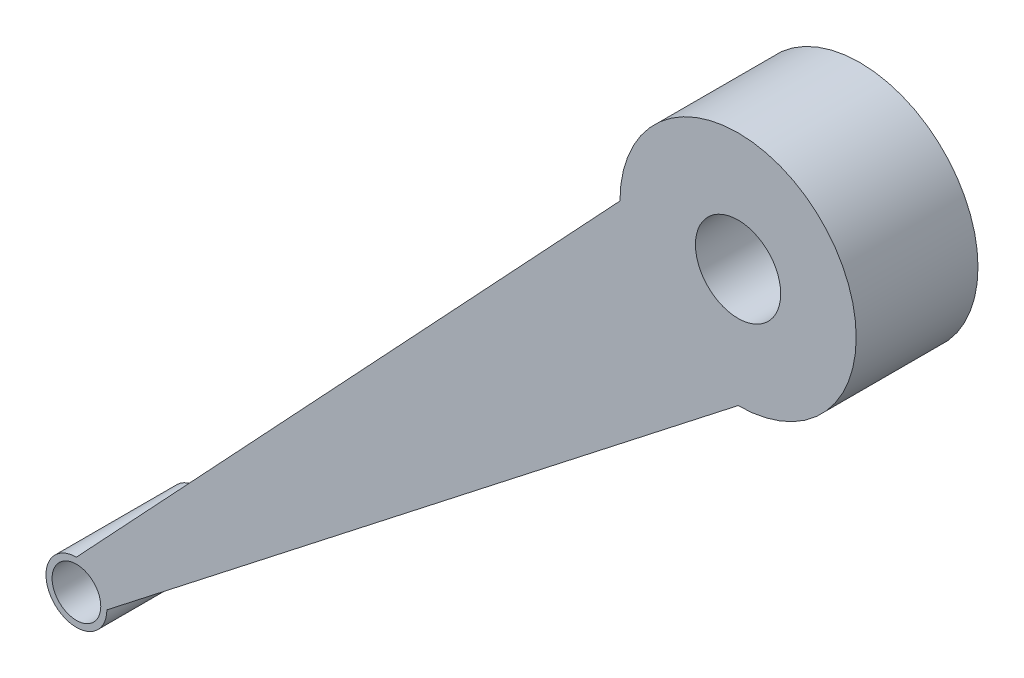
ISO-10303-21;
HEADER;
FILE_DESCRIPTION(('STEP AP214'),'2;1');
FILE_NAME('part.step','',(''),(''),'','','');
FILE_SCHEMA(('AUTOMOTIVE_DESIGN { 1 0 10303 214 1 1 1 1 }'));
ENDSEC;
DATA;
#1=APPLICATION_CONTEXT('core data for automotive mechanical design processes');
#2=APPLICATION_PROTOCOL_DEFINITION('international standard','automotive_design',2000,#1);
#3=PRODUCT_CONTEXT('',#1,'mechanical');
#4=PRODUCT('Part','Part','',(#3));
#5=PRODUCT_RELATED_PRODUCT_CATEGORY('part','',(#4));
#6=PRODUCT_DEFINITION_FORMATION('','',#4);
#7=PRODUCT_DEFINITION_CONTEXT('part definition',#1,'design');
#8=PRODUCT_DEFINITION('design','',#6,#7);
#9=PRODUCT_DEFINITION_SHAPE('','',#8);
#10=(LENGTH_UNIT() NAMED_UNIT(*) SI_UNIT(.MILLI.,.METRE.));
#11=(NAMED_UNIT(*) PLANE_ANGLE_UNIT() SI_UNIT($,.RADIAN.));
#12=(NAMED_UNIT(*) SI_UNIT($,.STERADIAN.) SOLID_ANGLE_UNIT());
#13=UNCERTAINTY_MEASURE_WITH_UNIT(LENGTH_MEASURE(1.E-05),#10,'distance_accuracy_value','');
#14=(GEOMETRIC_REPRESENTATION_CONTEXT(3) GLOBAL_UNCERTAINTY_ASSIGNED_CONTEXT((#13)) GLOBAL_UNIT_ASSIGNED_CONTEXT((#10,
#11,#12)) REPRESENTATION_CONTEXT('',''));
#15=CARTESIAN_POINT('',(0.,0.,0.));
#16=DIRECTION('',(0.,0.,1.));
#17=DIRECTION('',(1.,0.,0.));
#18=AXIS2_PLACEMENT_3D('',#15,#16,#17);
#19=CARTESIAN_POINT('',(0.,1.99999999999999,10.));
#20=DIRECTION('',(0.,0.,-1.));
#21=DIRECTION('',(-1.,0.,0.));
#22=AXIS2_PLACEMENT_3D('',#19,#20,#21);
#23=CYLINDRICAL_SURFACE('',#22,2.5);
#24=CARTESIAN_POINT('',(0.,1.99999999999999,5.));
#25=DIRECTION('',(0.,0.,1.));
#26=DIRECTION('',(1.,0.,0.));
#27=AXIS2_PLACEMENT_3D('',#24,#25,#26);
#28=CIRCLE('',#27,2.5);
#29=CARTESIAN_POINT('',(2.25573789684042,3.07779707772748,5.));
#30=VERTEX_POINT('',#29);
#31=CARTESIAN_POINT('',(1.12141430777746,4.2343746217481,5.));
#32=VERTEX_POINT('',#31);
#33=EDGE_CURVE('E137',#30,#32,#28,.T.);
#34=ORIENTED_EDGE('',*,*,#33,.F.);
#35=DIRECTION('',(0.,0.,-1.));
#36=VECTOR('',#35,1.);
#37=CARTESIAN_POINT('',(2.25573789684042,3.07779707772748,10.));
#38=LINE('',#37,#36);
#39=CARTESIAN_POINT('',(2.25573789684042,3.07779707772748,0.));
#40=VERTEX_POINT('',#39);
#41=EDGE_CURVE('E68',#30,#40,#38,.T.);
#42=ORIENTED_EDGE('',*,*,#41,.T.);
#43=CARTESIAN_POINT('',(0.,1.99999999999999,0.));
#44=DIRECTION('',(0.,0.,1.));
#45=DIRECTION('',(1.,0.,0.));
#46=AXIS2_PLACEMENT_3D('',#43,#44,#45);
#47=CIRCLE('',#46,2.5);
#48=CARTESIAN_POINT('',(1.12141430777746,4.23437462174809,0.));
#49=VERTEX_POINT('',#48);
#50=EDGE_CURVE('E191',#40,#49,#47,.T.);
#51=ORIENTED_EDGE('',*,*,#50,.T.);
#52=DIRECTION('',(0.,0.,-1.));
#53=VECTOR('',#52,1.);
#54=CARTESIAN_POINT('',(1.12141430777746,4.23437462174809,10.));
#55=LINE('',#54,#53);
#56=EDGE_CURVE('E158',#32,#49,#55,.T.);
#57=ORIENTED_EDGE('',*,*,#56,.F.);
#58=EDGE_LOOP('',(#34,#42,#51,#57));
#59=FACE_BOUND('',#58,.T.);
#60=ADVANCED_FACE('F64',(#59),#23,.T.);
#61=CARTESIAN_POINT('',(-1.51542000767577,1.41964116131676,10.));
#62=DIRECTION('',(-0.729793083298628,0.683668088745907,0.));
#63=DIRECTION('',(-0.683668088745907,-0.729793083298628,0.));
#64=AXIS2_PLACEMENT_3D('',#61,#62,#63);
#65=PLANE('',#64);
#66=DIRECTION('',(0.683668088745907,0.729793083298628,0.));
#67=VECTOR('',#66,1.);
#68=CARTESIAN_POINT('',(-1.51542000767577,1.41964116131676,5.));
#69=LINE('',#68,#67);
#70=CARTESIAN_POINT('',(45.6369890721945,51.7532790388426,5.));
#71=VERTEX_POINT('',#70);
#72=EDGE_CURVE('E134',#32,#71,#69,.T.);
#73=ORIENTED_EDGE('',*,*,#72,.F.);
#74=ORIENTED_EDGE('',*,*,#56,.T.);
#75=DIRECTION('',(0.683668088745907,0.729793083298628,0.));
#76=VECTOR('',#75,1.);
#77=CARTESIAN_POINT('',(-1.51542000767577,1.41964116131676,0.));
#78=LINE('',#77,#76);
#79=CARTESIAN_POINT('',(45.6369890721945,51.7532790388426,0.));
#80=VERTEX_POINT('',#79);
#81=EDGE_CURVE('E155',#49,#80,#78,.T.);
#82=ORIENTED_EDGE('',*,*,#81,.T.);
#83=DIRECTION('',(0.,0.,-1.));
#84=VECTOR('',#83,1.);
#85=CARTESIAN_POINT('',(45.6369890721945,51.7532790388426,10.));
#86=LINE('',#85,#84);
#87=EDGE_CURVE('E147',#71,#80,#86,.T.);
#88=ORIENTED_EDGE('',*,*,#87,.F.);
#89=EDGE_LOOP('',(#73,#74,#82,#88));
#90=FACE_BOUND('',#89,.T.);
#91=ADVANCED_FACE('F153',(#90),#65,.F.);
#92=CARTESIAN_POINT('',(54.3284182216313,52.13936107717,10.));
#93=DIRECTION('',(0.,0.,-1.));
#94=DIRECTION('',(-1.,0.,0.));
#95=AXIS2_PLACEMENT_3D('',#92,#93,#94);
#96=CYLINDRICAL_SURFACE('',#95,8.69999999999999);
#97=DIRECTION('',(0.,0.,-1.));
#98=VECTOR('',#97,1.);
#99=CARTESIAN_POINT('',(53.9927510329799,43.4458389176272,10.));
#100=LINE('',#99,#98);
#101=CARTESIAN_POINT('',(53.9927510329799,43.4458389176272,5.));
#102=VERTEX_POINT('',#101);
#103=CARTESIAN_POINT('',(53.9927510329799,43.4458389176272,0.));
#104=VERTEX_POINT('',#103);
#105=EDGE_CURVE('E149',#102,#104,#100,.T.);
#106=ORIENTED_EDGE('',*,*,#105,.F.);
#107=CARTESIAN_POINT('',(54.3284182216313,52.13936107717,5.));
#108=DIRECTION('',(0.,0.,1.));
#109=DIRECTION('',(1.,0.,0.));
#110=AXIS2_PLACEMENT_3D('',#107,#108,#109);
#111=CIRCLE('',#110,8.69999999999999);
#112=EDGE_CURVE('E82',#71,#102,#111,.F.);
#113=ORIENTED_EDGE('',*,*,#112,.F.);
#114=ORIENTED_EDGE('',*,*,#87,.T.);
#115=CARTESIAN_POINT('',(54.3284182216313,52.13936107717,0.));
#116=DIRECTION('',(0.,0.,1.));
#117=DIRECTION('',(1.,0.,0.));
#118=AXIS2_PLACEMENT_3D('',#115,#116,#117);
#119=CIRCLE('',#118,8.69999999999999);
#120=EDGE_CURVE('E186',#104,#80,#119,.T.);
#121=ORIENTED_EDGE('',*,*,#120,.F.);
#122=EDGE_LOOP('',(#106,#113,#114,#121));
#123=FACE_BOUND('',#122,.T.);
#124=ADVANCED_FACE('F145',(#123),#96,.F.);
#125=CARTESIAN_POINT('',(-0.639097527111956,0.819088458305751,10.));
#126=DIRECTION('',(-0.615156584574477,0.788404957147445,0.));
#127=DIRECTION('',(-0.788404957147445,-0.615156584574477,0.));
#128=AXIS2_PLACEMENT_3D('',#125,#126,#127);
#129=PLANE('',#128);
#130=ORIENTED_EDGE('',*,*,#41,.F.);
#131=DIRECTION('',(-0.788404957147445,-0.615156584574477,0.));
#132=VECTOR('',#131,1.);
#133=CARTESIAN_POINT('',(-0.639097527111956,0.819088458305751,5.));
#134=LINE('',#133,#132);
#135=EDGE_CURVE('E151',#102,#30,#134,.T.);
#136=ORIENTED_EDGE('',*,*,#135,.F.);
#137=ORIENTED_EDGE('',*,*,#105,.T.);
#138=DIRECTION('',(0.788404957147445,0.615156584574477,0.));
#139=VECTOR('',#138,1.);
#140=CARTESIAN_POINT('',(-0.639097527111956,0.819088458305751,0.));
#141=LINE('',#140,#139);
#142=EDGE_CURVE('E195',#40,#104,#141,.T.);
#143=ORIENTED_EDGE('',*,*,#142,.F.);
#144=EDGE_LOOP('',(#130,#136,#137,#143));
#145=FACE_BOUND('',#144,.T.);
#146=ADVANCED_FACE('F66',(#145),#129,.T.);
#147=CARTESIAN_POINT('',(0.,4.49999999999999,0.));
#148=VERTEX_POINT('',#147);
#149=CARTESIAN_POINT('',(2.49999999999999,1.99999999999999,0.));
#150=VERTEX_POINT('',#149);
#151=EDGE_CURVE('E185',#148,#150,#47,.T.);
#152=ORIENTED_EDGE('',*,*,#151,.T.);
#153=DIRECTION('',(0.,0.,-1.));
#154=VECTOR('',#153,1.);
#155=CARTESIAN_POINT('',(2.49999999999999,1.99999999999999,10.));
#156=LINE('',#155,#154);
#157=CARTESIAN_POINT('',(2.49999999999999,1.99999999999999,10.));
#158=VERTEX_POINT('',#157);
#159=EDGE_CURVE('E12',#158,#150,#156,.T.);
#160=ORIENTED_EDGE('',*,*,#159,.F.);
#161=CARTESIAN_POINT('',(0.,1.99999999999999,10.));
#162=DIRECTION('',(0.,0.,1.));
#163=DIRECTION('',(1.,0.,0.));
#164=AXIS2_PLACEMENT_3D('',#161,#162,#163);
#165=CIRCLE('',#164,2.5);
#166=CARTESIAN_POINT('',(0.,4.49999999999999,10.));
#167=VERTEX_POINT('',#166);
#168=EDGE_CURVE('E177',#167,#158,#165,.T.);
#169=ORIENTED_EDGE('',*,*,#168,.F.);
#170=DIRECTION('',(0.,0.,-1.));
#171=VECTOR('',#170,1.);
#172=CARTESIAN_POINT('',(0.,4.49999999999999,10.));
#173=LINE('',#172,#171);
#174=EDGE_CURVE('E91',#167,#148,#173,.T.);
#175=ORIENTED_EDGE('',*,*,#174,.T.);
#176=EDGE_LOOP('',(#152,#160,#169,#175));
#177=FACE_BOUND('',#176,.T.);
#178=ADVANCED_FACE('F246',(#177),#23,.T.);
#179=CARTESIAN_POINT('',(-0.0239409425374789,0.030683501158306,10.));
#180=DIRECTION('',(-0.615156584574477,0.788404957147445,0.));
#181=DIRECTION('',(-0.788404957147445,-0.615156584574477,0.));
#182=AXIS2_PLACEMENT_3D('',#179,#180,#181);
#183=PLANE('',#182);
#184=DIRECTION('',(0.788404957147445,0.615156584574477,0.));
#185=VECTOR('',#184,1.);
#186=CARTESIAN_POINT('',(-0.0239409425374789,0.030683501158306,0.));
#187=LINE('',#186,#185);
#188=CARTESIAN_POINT('',(54.3284182216313,42.43936107717,0.));
#189=VERTEX_POINT('',#188);
#190=EDGE_CURVE('E182',#150,#189,#187,.T.);
#191=ORIENTED_EDGE('',*,*,#190,.T.);
#192=DIRECTION('',(0.,0.,-1.));
#193=VECTOR('',#192,1.);
#194=CARTESIAN_POINT('',(54.3284182216313,42.43936107717,10.));
#195=LINE('',#194,#193);
#196=CARTESIAN_POINT('',(54.3284182216313,42.43936107717,10.));
#197=VERTEX_POINT('',#196);
#198=EDGE_CURVE('E74',#197,#189,#195,.T.);
#199=ORIENTED_EDGE('',*,*,#198,.F.);
#200=DIRECTION('',(0.788404957147445,0.615156584574477,0.));
#201=VECTOR('',#200,1.);
#202=CARTESIAN_POINT('',(-0.0239409425374789,0.030683501158306,10.));
#203=LINE('',#202,#201);
#204=EDGE_CURVE('E205',#158,#197,#203,.T.);
#205=ORIENTED_EDGE('',*,*,#204,.F.);
#206=ORIENTED_EDGE('',*,*,#159,.T.);
#207=EDGE_LOOP('',(#191,#199,#205,#206));
#208=FACE_BOUND('',#207,.T.);
#209=ADVANCED_FACE('F256',(#208),#183,.F.);
#210=CARTESIAN_POINT('',(54.3284182216313,52.13936107717,10.));
#211=DIRECTION('',(0.,0.,-1.));
#212=DIRECTION('',(-1.,0.,0.));
#213=AXIS2_PLACEMENT_3D('',#210,#211,#212);
#214=CYLINDRICAL_SURFACE('',#213,9.69999999999999);
#215=CARTESIAN_POINT('',(54.3284182216313,52.13936107717,0.));
#216=DIRECTION('',(0.,0.,1.));
#217=DIRECTION('',(1.,0.,0.));
#218=AXIS2_PLACEMENT_3D('',#215,#216,#217);
#219=CIRCLE('',#218,9.69999999999999);
#220=CARTESIAN_POINT('',(44.6284182216313,52.13936107717,0.));
#221=VERTEX_POINT('',#220);
#222=EDGE_CURVE('E178',#189,#221,#219,.T.);
#223=ORIENTED_EDGE('',*,*,#222,.T.);
#224=DIRECTION('',(0.,0.,-1.));
#225=VECTOR('',#224,1.);
#226=CARTESIAN_POINT('',(44.6284182216313,52.13936107717,10.));
#227=LINE('',#226,#225);
#228=CARTESIAN_POINT('',(44.6284182216313,52.13936107717,10.));
#229=VERTEX_POINT('',#228);
#230=EDGE_CURVE('E168',#229,#221,#227,.T.);
#231=ORIENTED_EDGE('',*,*,#230,.F.);
#232=CARTESIAN_POINT('',(54.3284182216313,52.13936107717,10.));
#233=DIRECTION('',(0.,0.,1.));
#234=DIRECTION('',(1.,0.,0.));
#235=AXIS2_PLACEMENT_3D('',#232,#233,#234);
#236=CIRCLE('',#235,9.69999999999999);
#237=EDGE_CURVE('E202',#197,#229,#236,.T.);
#238=ORIENTED_EDGE('',*,*,#237,.F.);
#239=ORIENTED_EDGE('',*,*,#198,.T.);
#240=EDGE_LOOP('',(#223,#231,#238,#239));
#241=FACE_BOUND('',#240,.T.);
#242=ADVANCED_FACE('F260',(#241),#214,.T.);
#243=CARTESIAN_POINT('',(-2.2452130909744,2.10330925006267,10.));
#244=DIRECTION('',(-0.729793083298628,0.683668088745907,0.));
#245=DIRECTION('',(-0.683668088745907,-0.729793083298628,0.));
#246=AXIS2_PLACEMENT_3D('',#243,#244,#245);
#247=PLANE('',#246);
#248=DIRECTION('',(0.683668088745907,0.729793083298628,0.));
#249=VECTOR('',#248,1.);
#250=CARTESIAN_POINT('',(-2.2452130909744,2.10330925006267,0.));
#251=LINE('',#250,#249);
#252=EDGE_CURVE('E173',#148,#221,#251,.T.);
#253=ORIENTED_EDGE('',*,*,#252,.F.);
#254=ORIENTED_EDGE('',*,*,#174,.F.);
#255=DIRECTION('',(0.683668088745907,0.729793083298628,0.));
#256=VECTOR('',#255,1.);
#257=CARTESIAN_POINT('',(-2.2452130909744,2.10330925006267,10.));
#258=LINE('',#257,#256);
#259=EDGE_CURVE('E162',#167,#229,#258,.T.);
#260=ORIENTED_EDGE('',*,*,#259,.T.);
#261=ORIENTED_EDGE('',*,*,#230,.T.);
#262=EDGE_LOOP('',(#253,#254,#260,#261));
#263=FACE_BOUND('',#262,.T.);
#264=ADVANCED_FACE('F270',(#263),#247,.T.);
#265=CARTESIAN_POINT('',(0.,0.,0.));
#266=DIRECTION('',(0.,0.,1.));
#267=DIRECTION('',(1.,0.,0.));
#268=AXIS2_PLACEMENT_3D('',#265,#266,#267);
#269=PLANE('',#268);
#270=CARTESIAN_POINT('',(0.,1.99999999999999,0.));
#271=DIRECTION('',(0.,0.,1.));
#272=DIRECTION('',(1.,0.,0.));
#273=AXIS2_PLACEMENT_3D('',#270,#271,#272);
#274=CIRCLE('',#273,2.);
#275=CARTESIAN_POINT('',(1.99999999999999,1.99999999999999,0.));
#276=VERTEX_POINT('',#275);
#277=EDGE_CURVE('E199',#276,#276,#274,.T.);
#278=ORIENTED_EDGE('',*,*,#277,.T.);
#279=EDGE_LOOP('',(#278));
#280=FACE_BOUND('',#279,.T.);
#281=ORIENTED_EDGE('',*,*,#190,.F.);
#282=ORIENTED_EDGE('',*,*,#151,.F.);
#283=ORIENTED_EDGE('',*,*,#252,.T.);
#284=ORIENTED_EDGE('',*,*,#222,.F.);
#285=EDGE_LOOP('',(#281,#282,#283,#284));
#286=FACE_BOUND('',#285,.T.);
#287=ORIENTED_EDGE('',*,*,#81,.F.);
#288=ORIENTED_EDGE('',*,*,#50,.F.);
#289=ORIENTED_EDGE('',*,*,#142,.T.);
#290=ORIENTED_EDGE('',*,*,#120,.T.);
#291=EDGE_LOOP('',(#287,#288,#289,#290));
#292=FACE_BOUND('',#291,.T.);
#293=ADVANCED_FACE('F264',(#280,#286,#292),#269,.F.);
#294=CARTESIAN_POINT('',(0.,0.,10.));
#295=DIRECTION('',(0.,0.,1.));
#296=DIRECTION('',(1.,0.,0.));
#297=AXIS2_PLACEMENT_3D('',#294,#295,#296);
#298=PLANE('',#297);
#299=CARTESIAN_POINT('',(54.3284182216313,52.13936107717,10.));
#300=DIRECTION('',(0.,0.,1.));
#301=DIRECTION('',(1.,0.,0.));
#302=AXIS2_PLACEMENT_3D('',#299,#300,#301);
#303=CIRCLE('',#302,3.5);
#304=CARTESIAN_POINT('',(57.8284182216314,52.13936107717,10.));
#305=VERTEX_POINT('',#304);
#306=EDGE_CURVE('E222',#305,#305,#303,.T.);
#307=ORIENTED_EDGE('',*,*,#306,.F.);
#308=EDGE_LOOP('',(#307));
#309=FACE_BOUND('',#308,.T.);
#310=CARTESIAN_POINT('',(0.,1.99999999999999,10.));
#311=DIRECTION('',(0.,0.,1.));
#312=DIRECTION('',(1.,0.,0.));
#313=AXIS2_PLACEMENT_3D('',#310,#311,#312);
#314=CIRCLE('',#313,2.);
#315=CARTESIAN_POINT('',(1.99999999999999,1.99999999999999,10.));
#316=VERTEX_POINT('',#315);
#317=EDGE_CURVE('E211',#316,#316,#314,.T.);
#318=ORIENTED_EDGE('',*,*,#317,.F.);
#319=EDGE_LOOP('',(#318));
#320=FACE_BOUND('',#319,.T.);
#321=ORIENTED_EDGE('',*,*,#168,.T.);
#322=ORIENTED_EDGE('',*,*,#204,.T.);
#323=ORIENTED_EDGE('',*,*,#237,.T.);
#324=ORIENTED_EDGE('',*,*,#259,.F.);
#325=EDGE_LOOP('',(#321,#322,#323,#324));
#326=FACE_BOUND('',#325,.T.);
#327=ADVANCED_FACE('F243',(#309,#320,#326),#298,.T.);
#328=CARTESIAN_POINT('',(0.,1.99999999999999,0.));
#329=DIRECTION('',(0.,0.,1.));
#330=DIRECTION('',(1.,0.,0.));
#331=AXIS2_PLACEMENT_3D('',#328,#329,#330);
#332=CYLINDRICAL_SURFACE('',#331,2.);
#333=ORIENTED_EDGE('',*,*,#277,.F.);
#334=EDGE_LOOP('',(#333));
#335=FACE_BOUND('',#334,.T.);
#336=ORIENTED_EDGE('',*,*,#317,.T.);
#337=EDGE_LOOP('',(#336));
#338=FACE_BOUND('',#337,.T.);
#339=ADVANCED_FACE('F234',(#335,#338),#332,.F.);
#340=CARTESIAN_POINT('',(0.,0.,5.));
#341=DIRECTION('',(0.,0.,1.));
#342=DIRECTION('',(1.,0.,0.));
#343=AXIS2_PLACEMENT_3D('',#340,#341,#342);
#344=PLANE('',#343);
#345=CARTESIAN_POINT('',(54.3284182216313,52.13936107717,5.));
#346=DIRECTION('',(0.,0.,-1.));
#347=DIRECTION('',(-1.,0.,0.));
#348=AXIS2_PLACEMENT_3D('',#345,#346,#347);
#349=CIRCLE('',#348,3.5);
#350=CARTESIAN_POINT('',(50.8284182216313,52.13936107717,5.));
#351=VERTEX_POINT('',#350);
#352=EDGE_CURVE('E226',#351,#351,#349,.T.);
#353=ORIENTED_EDGE('',*,*,#352,.F.);
#354=EDGE_LOOP('',(#353));
#355=FACE_BOUND('',#354,.T.);
#356=ORIENTED_EDGE('',*,*,#135,.T.);
#357=ORIENTED_EDGE('',*,*,#33,.T.);
#358=ORIENTED_EDGE('',*,*,#72,.T.);
#359=ORIENTED_EDGE('',*,*,#112,.T.);
#360=EDGE_LOOP('',(#356,#357,#358,#359));
#361=FACE_BOUND('',#360,.T.);
#362=ADVANCED_FACE('F135',(#355,#361),#344,.F.);
#363=CARTESIAN_POINT('',(54.3284182216313,52.13936107717,15.));
#364=DIRECTION('',(0.,0.,-1.));
#365=DIRECTION('',(-1.,0.,0.));
#366=AXIS2_PLACEMENT_3D('',#363,#364,#365);
#367=CYLINDRICAL_SURFACE('',#366,3.5);
#368=ORIENTED_EDGE('',*,*,#306,.T.);
#369=EDGE_LOOP('',(#368));
#370=FACE_BOUND('',#369,.T.);
#371=ORIENTED_EDGE('',*,*,#352,.T.);
#372=EDGE_LOOP('',(#371));
#373=FACE_BOUND('',#372,.T.);
#374=ADVANCED_FACE('F231',(#370,#373),#367,.F.);
#375=CLOSED_SHELL('',(#60,#91,#124,#146,#178,#209,#242,#264,#293,#327,#339,#362,#374));
#376=MANIFOLD_SOLID_BREP('B2',#375);
#377=ADVANCED_BREP_SHAPE_REPRESENTATION('',(#18,#376),#14);
#378=SHAPE_DEFINITION_REPRESENTATION(#9,#377);
ENDSEC;
END-ISO-10303-21;
